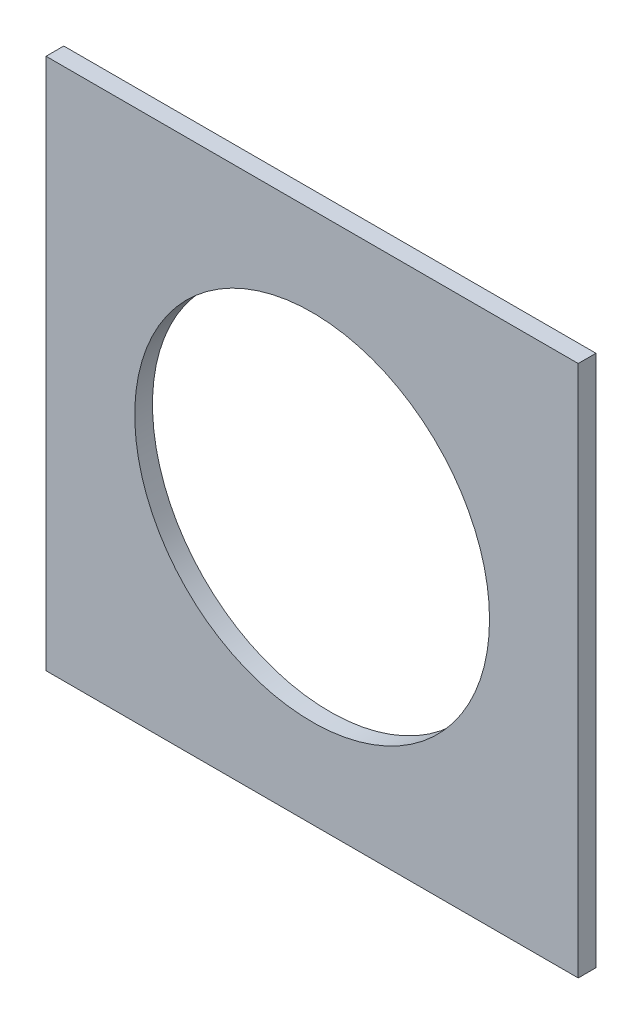
ISO-10303-21;
HEADER;
FILE_DESCRIPTION(('STEP AP214'),'2;1');
FILE_NAME('part.step','',(''),(''),'','','');
FILE_SCHEMA(('AUTOMOTIVE_DESIGN { 1 0 10303 214 1 1 1 1 }'));
ENDSEC;
DATA;
#1=APPLICATION_CONTEXT('core data for automotive mechanical design processes');
#2=APPLICATION_PROTOCOL_DEFINITION('international standard','automotive_design',2000,#1);
#3=PRODUCT_CONTEXT('',#1,'mechanical');
#4=PRODUCT('Part','Part','',(#3));
#5=PRODUCT_RELATED_PRODUCT_CATEGORY('part','',(#4));
#6=PRODUCT_DEFINITION_FORMATION('','',#4);
#7=PRODUCT_DEFINITION_CONTEXT('part definition',#1,'design');
#8=PRODUCT_DEFINITION('design','',#6,#7);
#9=PRODUCT_DEFINITION_SHAPE('','',#8);
#10=(LENGTH_UNIT() NAMED_UNIT(*) SI_UNIT(.MILLI.,.METRE.));
#11=(NAMED_UNIT(*) PLANE_ANGLE_UNIT() SI_UNIT($,.RADIAN.));
#12=(NAMED_UNIT(*) SI_UNIT($,.STERADIAN.) SOLID_ANGLE_UNIT());
#13=UNCERTAINTY_MEASURE_WITH_UNIT(LENGTH_MEASURE(1.E-05),#10,'distance_accuracy_value','');
#14=(GEOMETRIC_REPRESENTATION_CONTEXT(3) GLOBAL_UNCERTAINTY_ASSIGNED_CONTEXT((#13)) GLOBAL_UNIT_ASSIGNED_CONTEXT((#10,
#11,#12)) REPRESENTATION_CONTEXT('',''));
#15=CARTESIAN_POINT('',(0.,0.,0.));
#16=DIRECTION('',(0.,0.,1.));
#17=DIRECTION('',(1.,0.,0.));
#18=AXIS2_PLACEMENT_3D('',#15,#16,#17);
#19=CARTESIAN_POINT('',(0.,0.,1.));
#20=DIRECTION('',(0.,0.,-1.));
#21=DIRECTION('',(-1.,0.,0.));
#22=AXIS2_PLACEMENT_3D('',#19,#20,#21);
#23=PLANE('',#22);
#24=DIRECTION('',(0.,-1.,0.));
#25=VECTOR('',#24,1.);
#26=CARTESIAN_POINT('',(-15.,15.,1.));
#27=LINE('',#26,#25);
#28=CARTESIAN_POINT('',(-15.,15.,1.));
#29=VERTEX_POINT('',#28);
#30=CARTESIAN_POINT('',(-15.,-15.,1.));
#31=VERTEX_POINT('',#30);
#32=EDGE_CURVE('E85',#29,#31,#27,.T.);
#33=ORIENTED_EDGE('',*,*,#32,.T.);
#34=DIRECTION('',(1.,0.,0.));
#35=VECTOR('',#34,1.);
#36=CARTESIAN_POINT('',(15.,-15.,1.));
#37=LINE('',#36,#35);
#38=CARTESIAN_POINT('',(15.,-15.,1.));
#39=VERTEX_POINT('',#38);
#40=EDGE_CURVE('E80',#31,#39,#37,.T.);
#41=ORIENTED_EDGE('',*,*,#40,.T.);
#42=DIRECTION('',(0.,1.,0.));
#43=VECTOR('',#42,1.);
#44=CARTESIAN_POINT('',(15.,15.,1.));
#45=LINE('',#44,#43);
#46=CARTESIAN_POINT('',(15.,15.,1.));
#47=VERTEX_POINT('',#46);
#48=EDGE_CURVE('E83',#39,#47,#45,.T.);
#49=ORIENTED_EDGE('',*,*,#48,.T.);
#50=DIRECTION('',(-1.,0.,0.));
#51=VECTOR('',#50,1.);
#52=CARTESIAN_POINT('',(15.,15.,1.));
#53=LINE('',#52,#51);
#54=EDGE_CURVE('E50',#47,#29,#53,.T.);
#55=ORIENTED_EDGE('',*,*,#54,.T.);
#56=EDGE_LOOP('',(#33,#41,#49,#55));
#57=FACE_BOUND('',#56,.T.);
#58=CARTESIAN_POINT('',(0.,0.,1.));
#59=DIRECTION('',(0.,0.,1.));
#60=DIRECTION('',(1.,0.,0.));
#61=AXIS2_PLACEMENT_3D('',#58,#59,#60);
#62=CIRCLE('',#61,10.);
#63=CARTESIAN_POINT('',(10.,0.,1.));
#64=VERTEX_POINT('',#63);
#65=EDGE_CURVE('E100',#64,#64,#62,.T.);
#66=ORIENTED_EDGE('',*,*,#65,.F.);
#67=EDGE_LOOP('',(#66));
#68=FACE_BOUND('',#67,.T.);
#69=ADVANCED_FACE('F33',(#57,#68),#23,.F.);
#70=CARTESIAN_POINT('',(0.,0.,0.));
#71=DIRECTION('',(0.,0.,-1.));
#72=DIRECTION('',(-1.,0.,0.));
#73=AXIS2_PLACEMENT_3D('',#70,#71,#72);
#74=PLANE('',#73);
#75=DIRECTION('',(0.,-1.,0.));
#76=VECTOR('',#75,1.);
#77=CARTESIAN_POINT('',(-15.,15.,0.));
#78=LINE('',#77,#76);
#79=CARTESIAN_POINT('',(-15.,15.,0.));
#80=VERTEX_POINT('',#79);
#81=CARTESIAN_POINT('',(-15.,-15.,0.));
#82=VERTEX_POINT('',#81);
#83=EDGE_CURVE('E97',#80,#82,#78,.T.);
#84=ORIENTED_EDGE('',*,*,#83,.F.);
#85=DIRECTION('',(-1.,0.,0.));
#86=VECTOR('',#85,1.);
#87=CARTESIAN_POINT('',(15.,15.,0.));
#88=LINE('',#87,#86);
#89=CARTESIAN_POINT('',(15.,15.,0.));
#90=VERTEX_POINT('',#89);
#91=EDGE_CURVE('E73',#90,#80,#88,.T.);
#92=ORIENTED_EDGE('',*,*,#91,.F.);
#93=DIRECTION('',(0.,1.,0.));
#94=VECTOR('',#93,1.);
#95=CARTESIAN_POINT('',(15.,15.,0.));
#96=LINE('',#95,#94);
#97=CARTESIAN_POINT('',(15.,-15.,0.));
#98=VERTEX_POINT('',#97);
#99=EDGE_CURVE('E67',#98,#90,#96,.T.);
#100=ORIENTED_EDGE('',*,*,#99,.F.);
#101=DIRECTION('',(1.,0.,0.));
#102=VECTOR('',#101,1.);
#103=CARTESIAN_POINT('',(15.,-15.,0.));
#104=LINE('',#103,#102);
#105=EDGE_CURVE('E89',#82,#98,#104,.T.);
#106=ORIENTED_EDGE('',*,*,#105,.F.);
#107=EDGE_LOOP('',(#84,#92,#100,#106));
#108=FACE_BOUND('',#107,.T.);
#109=CARTESIAN_POINT('',(0.,0.,0.));
#110=DIRECTION('',(0.,0.,1.));
#111=DIRECTION('',(1.,0.,0.));
#112=AXIS2_PLACEMENT_3D('',#109,#110,#111);
#113=CIRCLE('',#112,10.);
#114=CARTESIAN_POINT('',(10.,0.,0.));
#115=VERTEX_POINT('',#114);
#116=EDGE_CURVE('E112',#115,#115,#113,.T.);
#117=ORIENTED_EDGE('',*,*,#116,.T.);
#118=EDGE_LOOP('',(#117));
#119=FACE_BOUND('',#118,.T.);
#120=ADVANCED_FACE('F108',(#108,#119),#74,.T.);
#121=CARTESIAN_POINT('',(-15.,15.,1.));
#122=DIRECTION('',(1.,0.,0.));
#123=DIRECTION('',(0.,1.,0.));
#124=AXIS2_PLACEMENT_3D('',#121,#122,#123);
#125=PLANE('',#124);
#126=ORIENTED_EDGE('',*,*,#83,.T.);
#127=DIRECTION('',(0.,0.,-1.));
#128=VECTOR('',#127,1.);
#129=CARTESIAN_POINT('',(-15.,-15.,1.));
#130=LINE('',#129,#128);
#131=EDGE_CURVE('E11',#31,#82,#130,.T.);
#132=ORIENTED_EDGE('',*,*,#131,.F.);
#133=ORIENTED_EDGE('',*,*,#32,.F.);
#134=DIRECTION('',(0.,0.,-1.));
#135=VECTOR('',#134,1.);
#136=CARTESIAN_POINT('',(-15.,15.,1.));
#137=LINE('',#136,#135);
#138=EDGE_CURVE('E93',#29,#80,#137,.T.);
#139=ORIENTED_EDGE('',*,*,#138,.T.);
#140=EDGE_LOOP('',(#126,#132,#133,#139));
#141=FACE_BOUND('',#140,.T.);
#142=ADVANCED_FACE('F35',(#141),#125,.F.);
#143=CARTESIAN_POINT('',(15.,-15.,1.));
#144=DIRECTION('',(0.,1.,0.));
#145=DIRECTION('',(-1.,0.,0.));
#146=AXIS2_PLACEMENT_3D('',#143,#144,#145);
#147=PLANE('',#146);
#148=ORIENTED_EDGE('',*,*,#105,.T.);
#149=DIRECTION('',(0.,0.,-1.));
#150=VECTOR('',#149,1.);
#151=CARTESIAN_POINT('',(15.,-15.,1.));
#152=LINE('',#151,#150);
#153=EDGE_CURVE('E42',#39,#98,#152,.T.);
#154=ORIENTED_EDGE('',*,*,#153,.F.);
#155=ORIENTED_EDGE('',*,*,#40,.F.);
#156=ORIENTED_EDGE('',*,*,#131,.T.);
#157=EDGE_LOOP('',(#148,#154,#155,#156));
#158=FACE_BOUND('',#157,.T.);
#159=ADVANCED_FACE('F88',(#158),#147,.F.);
#160=CARTESIAN_POINT('',(15.,15.,1.));
#161=DIRECTION('',(-1.,0.,0.));
#162=DIRECTION('',(0.,-1.,0.));
#163=AXIS2_PLACEMENT_3D('',#160,#161,#162);
#164=PLANE('',#163);
#165=ORIENTED_EDGE('',*,*,#99,.T.);
#166=DIRECTION('',(0.,0.,-1.));
#167=VECTOR('',#166,1.);
#168=CARTESIAN_POINT('',(15.,15.,1.));
#169=LINE('',#168,#167);
#170=EDGE_CURVE('E90',#47,#90,#169,.T.);
#171=ORIENTED_EDGE('',*,*,#170,.F.);
#172=ORIENTED_EDGE('',*,*,#48,.F.);
#173=ORIENTED_EDGE('',*,*,#153,.T.);
#174=EDGE_LOOP('',(#165,#171,#172,#173));
#175=FACE_BOUND('',#174,.T.);
#176=ADVANCED_FACE('F91',(#175),#164,.F.);
#177=CARTESIAN_POINT('',(15.,15.,1.));
#178=DIRECTION('',(0.,-1.,0.));
#179=DIRECTION('',(1.,0.,0.));
#180=AXIS2_PLACEMENT_3D('',#177,#178,#179);
#181=PLANE('',#180);
#182=ORIENTED_EDGE('',*,*,#91,.T.);
#183=ORIENTED_EDGE('',*,*,#138,.F.);
#184=ORIENTED_EDGE('',*,*,#54,.F.);
#185=ORIENTED_EDGE('',*,*,#170,.T.);
#186=EDGE_LOOP('',(#182,#183,#184,#185));
#187=FACE_BOUND('',#186,.T.);
#188=ADVANCED_FACE('F105',(#187),#181,.F.);
#189=CARTESIAN_POINT('',(0.,0.,1.));
#190=DIRECTION('',(0.,0.,-1.));
#191=DIRECTION('',(-1.,0.,0.));
#192=AXIS2_PLACEMENT_3D('',#189,#190,#191);
#193=CYLINDRICAL_SURFACE('',#192,10.);
#194=ORIENTED_EDGE('',*,*,#65,.T.);
#195=EDGE_LOOP('',(#194));
#196=FACE_BOUND('',#195,.T.);
#197=ORIENTED_EDGE('',*,*,#116,.F.);
#198=EDGE_LOOP('',(#197));
#199=FACE_BOUND('',#198,.T.);
#200=ADVANCED_FACE('F118',(#196,#199),#193,.F.);
#201=CLOSED_SHELL('',(#69,#120,#142,#159,#176,#188,#200));
#202=MANIFOLD_SOLID_BREP('B2',#201);
#203=ADVANCED_BREP_SHAPE_REPRESENTATION('',(#18,#202),#14);
#204=SHAPE_DEFINITION_REPRESENTATION(#9,#203);
ENDSEC;
END-ISO-10303-21;
